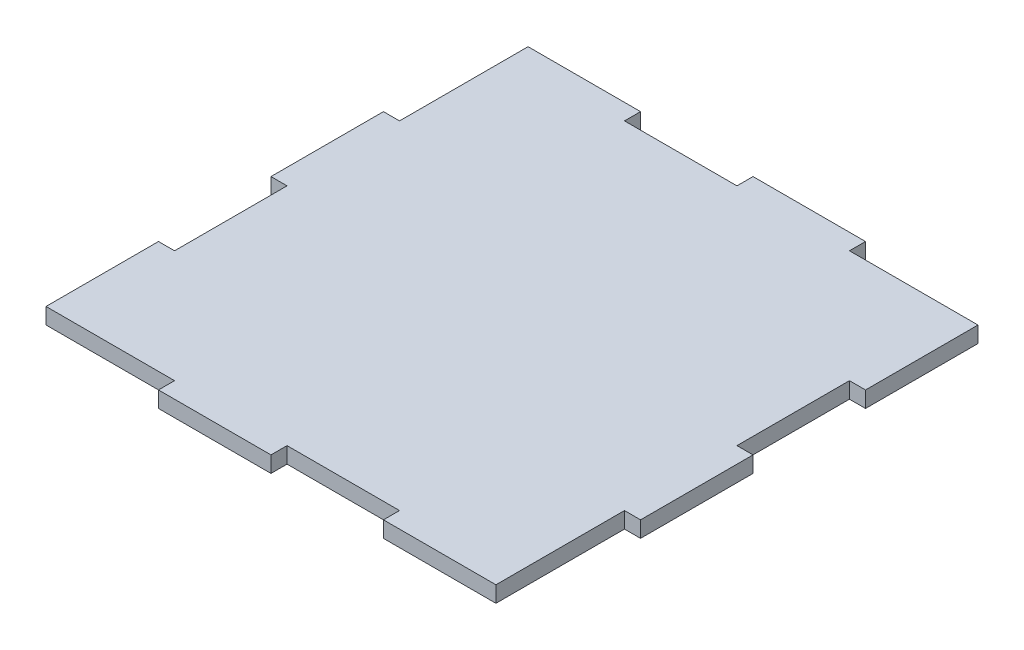
ISO-10303-21;
HEADER;
FILE_DESCRIPTION(('STEP AP214'),'2;1');
FILE_NAME('part.step','',(''),(''),'','','');
FILE_SCHEMA(('AUTOMOTIVE_DESIGN { 1 0 10303 214 1 1 1 1 }'));
ENDSEC;
DATA;
#1=APPLICATION_CONTEXT('core data for automotive mechanical design processes');
#2=APPLICATION_PROTOCOL_DEFINITION('international standard','automotive_design',2000,#1);
#3=PRODUCT_CONTEXT('',#1,'mechanical');
#4=PRODUCT('Part','Part','',(#3));
#5=PRODUCT_RELATED_PRODUCT_CATEGORY('part','',(#4));
#6=PRODUCT_DEFINITION_FORMATION('','',#4);
#7=PRODUCT_DEFINITION_CONTEXT('part definition',#1,'design');
#8=PRODUCT_DEFINITION('design','',#6,#7);
#9=PRODUCT_DEFINITION_SHAPE('','',#8);
#10=(LENGTH_UNIT() NAMED_UNIT(*) SI_UNIT(.MILLI.,.METRE.));
#11=(NAMED_UNIT(*) PLANE_ANGLE_UNIT() SI_UNIT($,.RADIAN.));
#12=(NAMED_UNIT(*) SI_UNIT($,.STERADIAN.) SOLID_ANGLE_UNIT());
#13=UNCERTAINTY_MEASURE_WITH_UNIT(LENGTH_MEASURE(1.E-05),#10,'distance_accuracy_value','');
#14=(GEOMETRIC_REPRESENTATION_CONTEXT(3) GLOBAL_UNCERTAINTY_ASSIGNED_CONTEXT((#13)) GLOBAL_UNIT_ASSIGNED_CONTEXT((#10,
#11,#12)) REPRESENTATION_CONTEXT('',''));
#15=CARTESIAN_POINT('',(0.,0.,0.));
#16=DIRECTION('',(0.,0.,1.));
#17=DIRECTION('',(1.,0.,0.));
#18=AXIS2_PLACEMENT_3D('',#15,#16,#17);
#19=CARTESIAN_POINT('',(0.,6.35,40.0372881355932));
#20=DIRECTION('',(0.,0.,-1.));
#21=DIRECTION('',(-1.,0.,0.));
#22=AXIS2_PLACEMENT_3D('',#19,#20,#21);
#23=PLANE('',#22);
#24=DIRECTION('',(1.,0.,0.));
#25=VECTOR('',#24,1.);
#26=CARTESIAN_POINT('',(0.,0.,40.0372881355932));
#27=LINE('',#26,#25);
#28=CARTESIAN_POINT('',(-118.856214689266,0.,40.0372881355932));
#29=VERTEX_POINT('',#28);
#30=CARTESIAN_POINT('',(-112.506214689266,0.,40.0372881355932));
#31=VERTEX_POINT('',#30);
#32=EDGE_CURVE('E248',#29,#31,#27,.T.);
#33=ORIENTED_EDGE('',*,*,#32,.F.);
#34=DIRECTION('',(0.,-1.,0.));
#35=VECTOR('',#34,1.);
#36=CARTESIAN_POINT('',(-118.856214689266,6.35,40.0372881355932));
#37=LINE('',#36,#35);
#38=CARTESIAN_POINT('',(-118.856214689266,6.35,40.0372881355932));
#39=VERTEX_POINT('',#38);
#40=EDGE_CURVE('E11',#39,#29,#37,.T.);
#41=ORIENTED_EDGE('',*,*,#40,.F.);
#42=DIRECTION('',(1.,0.,0.));
#43=VECTOR('',#42,1.);
#44=CARTESIAN_POINT('',(0.,6.35,40.0372881355932));
#45=LINE('',#44,#43);
#46=CARTESIAN_POINT('',(-112.506214689266,6.35,40.0372881355932));
#47=VERTEX_POINT('',#46);
#48=EDGE_CURVE('E397',#39,#47,#45,.T.);
#49=ORIENTED_EDGE('',*,*,#48,.T.);
#50=DIRECTION('',(0.,-1.,0.));
#51=VECTOR('',#50,1.);
#52=CARTESIAN_POINT('',(-112.506214689266,6.35,40.0372881355932));
#53=LINE('',#52,#51);
#54=EDGE_CURVE('E145',#47,#31,#53,.T.);
#55=ORIENTED_EDGE('',*,*,#54,.T.);
#56=EDGE_LOOP('',(#33,#41,#49,#55));
#57=FACE_BOUND('',#56,.T.);
#58=ADVANCED_FACE('F35',(#57),#23,.T.);
#59=CARTESIAN_POINT('',(-118.856214689266,6.35,0.));
#60=DIRECTION('',(-1.,0.,0.));
#61=DIRECTION('',(0.,0.,1.));
#62=AXIS2_PLACEMENT_3D('',#59,#60,#61);
#63=PLANE('',#62);
#64=DIRECTION('',(0.,0.,-1.));
#65=VECTOR('',#64,1.);
#66=CARTESIAN_POINT('',(-118.856214689266,0.,0.));
#67=LINE('',#66,#65);
#68=CARTESIAN_POINT('',(-118.856214689266,0.,84.4872881355932));
#69=VERTEX_POINT('',#68);
#70=EDGE_CURVE('E251',#69,#29,#67,.T.);
#71=ORIENTED_EDGE('',*,*,#70,.F.);
#72=DIRECTION('',(0.,-1.,0.));
#73=VECTOR('',#72,1.);
#74=CARTESIAN_POINT('',(-118.856214689266,6.35,84.4872881355932));
#75=LINE('',#74,#73);
#76=CARTESIAN_POINT('',(-118.856214689266,6.35,84.4872881355932));
#77=VERTEX_POINT('',#76);
#78=EDGE_CURVE('E43',#77,#69,#75,.T.);
#79=ORIENTED_EDGE('',*,*,#78,.F.);
#80=DIRECTION('',(0.,0.,-1.));
#81=VECTOR('',#80,1.);
#82=CARTESIAN_POINT('',(-118.856214689266,6.35,0.));
#83=LINE('',#82,#81);
#84=EDGE_CURVE('E393',#77,#39,#83,.T.);
#85=ORIENTED_EDGE('',*,*,#84,.T.);
#86=ORIENTED_EDGE('',*,*,#40,.T.);
#87=EDGE_LOOP('',(#71,#79,#85,#86));
#88=FACE_BOUND('',#87,.T.);
#89=ADVANCED_FACE('F381',(#88),#63,.T.);
#90=CARTESIAN_POINT('',(0.,6.35,84.4872881355932));
#91=DIRECTION('',(0.,0.,1.));
#92=DIRECTION('',(1.,0.,0.));
#93=AXIS2_PLACEMENT_3D('',#90,#91,#92);
#94=PLANE('',#93);
#95=DIRECTION('',(-1.,0.,0.));
#96=VECTOR('',#95,1.);
#97=CARTESIAN_POINT('',(0.,0.,84.4872881355932));
#98=LINE('',#97,#96);
#99=CARTESIAN_POINT('',(-68.0562146892665,0.,84.4872881355932));
#100=VERTEX_POINT('',#99);
#101=EDGE_CURVE('E254',#100,#69,#98,.T.);
#102=ORIENTED_EDGE('',*,*,#101,.F.);
#103=DIRECTION('',(0.,-1.,0.));
#104=VECTOR('',#103,1.);
#105=CARTESIAN_POINT('',(-68.0562146892665,6.35,84.4872881355932));
#106=LINE('',#105,#104);
#107=CARTESIAN_POINT('',(-68.0562146892665,6.35,84.4872881355932));
#108=VERTEX_POINT('',#107);
#109=EDGE_CURVE('E370',#108,#100,#106,.T.);
#110=ORIENTED_EDGE('',*,*,#109,.F.);
#111=DIRECTION('',(-1.,0.,0.));
#112=VECTOR('',#111,1.);
#113=CARTESIAN_POINT('',(0.,6.35,84.4872881355932));
#114=LINE('',#113,#112);
#115=EDGE_CURVE('E377',#108,#77,#114,.T.);
#116=ORIENTED_EDGE('',*,*,#115,.T.);
#117=ORIENTED_EDGE('',*,*,#78,.T.);
#118=EDGE_LOOP('',(#102,#110,#116,#117));
#119=FACE_BOUND('',#118,.T.);
#120=ADVANCED_FACE('F375',(#119),#94,.T.);
#121=CARTESIAN_POINT('',(-68.0562146892655,6.35,-7.43676934221016E-13));
#122=DIRECTION('',(-1.,0.,0.));
#123=DIRECTION('',(0.,0.,1.));
#124=AXIS2_PLACEMENT_3D('',#121,#122,#123);
#125=PLANE('',#124);
#126=DIRECTION('',(0.,0.,-1.));
#127=VECTOR('',#126,1.);
#128=CARTESIAN_POINT('',(-68.0562146892655,0.,-7.43676934221016E-13));
#129=LINE('',#128,#127);
#130=CARTESIAN_POINT('',(-68.0562146892665,0.,90.8372881355928));
#131=VERTEX_POINT('',#130);
#132=EDGE_CURVE('E257',#131,#100,#129,.T.);
#133=ORIENTED_EDGE('',*,*,#132,.F.);
#134=DIRECTION('',(0.,-1.,0.));
#135=VECTOR('',#134,1.);
#136=CARTESIAN_POINT('',(-68.0562146892665,6.35,90.8372881355928));
#137=LINE('',#136,#135);
#138=CARTESIAN_POINT('',(-68.0562146892665,6.35,90.8372881355928));
#139=VERTEX_POINT('',#138);
#140=EDGE_CURVE('E368',#139,#131,#137,.T.);
#141=ORIENTED_EDGE('',*,*,#140,.F.);
#142=DIRECTION('',(0.,0.,-1.));
#143=VECTOR('',#142,1.);
#144=CARTESIAN_POINT('',(-68.0562146892655,6.35,-7.43676934221016E-13));
#145=LINE('',#144,#143);
#146=EDGE_CURVE('E390',#139,#108,#145,.T.);
#147=ORIENTED_EDGE('',*,*,#146,.T.);
#148=ORIENTED_EDGE('',*,*,#109,.T.);
#149=EDGE_LOOP('',(#133,#141,#147,#148));
#150=FACE_BOUND('',#149,.T.);
#151=ADVANCED_FACE('F387',(#150),#125,.T.);
#152=CARTESIAN_POINT('',(-9.64254234704709E-13,6.35,90.8372881355935));
#153=DIRECTION('',(0.,0.,1.));
#154=DIRECTION('',(1.,0.,0.));
#155=AXIS2_PLACEMENT_3D('',#152,#153,#154);
#156=PLANE('',#155);
#157=DIRECTION('',(-1.,0.,0.));
#158=VECTOR('',#157,1.);
#159=CARTESIAN_POINT('',(-9.64254234704709E-13,0.,90.8372881355935));
#160=LINE('',#159,#158);
#161=CARTESIAN_POINT('',(-23.6062146892665,0.,90.8372881355932));
#162=VERTEX_POINT('',#161);
#163=EDGE_CURVE('E260',#162,#131,#160,.T.);
#164=ORIENTED_EDGE('',*,*,#163,.F.);
#165=DIRECTION('',(0.,-1.,0.));
#166=VECTOR('',#165,1.);
#167=CARTESIAN_POINT('',(-23.6062146892665,6.35,90.8372881355932));
#168=LINE('',#167,#166);
#169=CARTESIAN_POINT('',(-23.6062146892665,6.35,90.8372881355932));
#170=VERTEX_POINT('',#169);
#171=EDGE_CURVE('E366',#170,#162,#168,.T.);
#172=ORIENTED_EDGE('',*,*,#171,.F.);
#173=DIRECTION('',(-1.,0.,0.));
#174=VECTOR('',#173,1.);
#175=CARTESIAN_POINT('',(-9.64254234704709E-13,6.35,90.8372881355935));
#176=LINE('',#175,#174);
#177=EDGE_CURVE('E395',#170,#139,#176,.T.);
#178=ORIENTED_EDGE('',*,*,#177,.T.);
#179=ORIENTED_EDGE('',*,*,#140,.T.);
#180=EDGE_LOOP('',(#164,#172,#178,#179));
#181=FACE_BOUND('',#180,.T.);
#182=ADVANCED_FACE('F468',(#181),#156,.T.);
#183=CARTESIAN_POINT('',(-23.6062146892656,6.35,-2.32158924852762E-13));
#184=DIRECTION('',(1.,0.,0.));
#185=DIRECTION('',(0.,0.,-1.));
#186=AXIS2_PLACEMENT_3D('',#183,#184,#185);
#187=PLANE('',#186);
#188=DIRECTION('',(0.,0.,1.));
#189=VECTOR('',#188,1.);
#190=CARTESIAN_POINT('',(-23.6062146892656,0.,-2.32158924852762E-13));
#191=LINE('',#190,#189);
#192=CARTESIAN_POINT('',(-23.6062146892665,0.,84.4872881355932));
#193=VERTEX_POINT('',#192);
#194=EDGE_CURVE('E263',#193,#162,#191,.T.);
#195=ORIENTED_EDGE('',*,*,#194,.F.);
#196=DIRECTION('',(0.,-1.,0.));
#197=VECTOR('',#196,1.);
#198=CARTESIAN_POINT('',(-23.6062146892665,6.35,84.4872881355932));
#199=LINE('',#198,#197);
#200=CARTESIAN_POINT('',(-23.6062146892665,6.35,84.4872881355932));
#201=VERTEX_POINT('',#200);
#202=EDGE_CURVE('E364',#201,#193,#199,.T.);
#203=ORIENTED_EDGE('',*,*,#202,.F.);
#204=DIRECTION('',(0.,0.,1.));
#205=VECTOR('',#204,1.);
#206=CARTESIAN_POINT('',(-23.6062146892656,6.35,-2.32158924852762E-13));
#207=LINE('',#206,#205);
#208=EDGE_CURVE('E402',#201,#170,#207,.T.);
#209=ORIENTED_EDGE('',*,*,#208,.T.);
#210=ORIENTED_EDGE('',*,*,#171,.T.);
#211=EDGE_LOOP('',(#195,#203,#209,#210));
#212=FACE_BOUND('',#211,.T.);
#213=ADVANCED_FACE('F471',(#212),#187,.T.);
#214=CARTESIAN_POINT('',(0.,6.35,84.4872881355932));
#215=DIRECTION('',(0.,0.,-1.));
#216=DIRECTION('',(-1.,0.,0.));
#217=AXIS2_PLACEMENT_3D('',#214,#215,#216);
#218=PLANE('',#217);
#219=DIRECTION('',(1.,0.,0.));
#220=VECTOR('',#219,1.);
#221=CARTESIAN_POINT('',(0.,0.,84.4872881355932));
#222=LINE('',#221,#220);
#223=CARTESIAN_POINT('',(20.8437853107335,0.,84.4872881355932));
#224=VERTEX_POINT('',#223);
#225=EDGE_CURVE('E266',#193,#224,#222,.T.);
#226=ORIENTED_EDGE('',*,*,#225,.T.);
#227=DIRECTION('',(0.,-1.,0.));
#228=VECTOR('',#227,1.);
#229=CARTESIAN_POINT('',(20.8437853107335,6.35,84.4872881355932));
#230=LINE('',#229,#228);
#231=CARTESIAN_POINT('',(20.8437853107335,6.35,84.4872881355932));
#232=VERTEX_POINT('',#231);
#233=EDGE_CURVE('E362',#232,#224,#230,.T.);
#234=ORIENTED_EDGE('',*,*,#233,.F.);
#235=DIRECTION('',(1.,0.,0.));
#236=VECTOR('',#235,1.);
#237=CARTESIAN_POINT('',(0.,6.35,84.4872881355932));
#238=LINE('',#237,#236);
#239=EDGE_CURVE('E405',#201,#232,#238,.T.);
#240=ORIENTED_EDGE('',*,*,#239,.F.);
#241=ORIENTED_EDGE('',*,*,#202,.T.);
#242=EDGE_LOOP('',(#226,#234,#240,#241));
#243=FACE_BOUND('',#242,.T.);
#244=ADVANCED_FACE('F475',(#243),#218,.F.);
#245=CARTESIAN_POINT('',(20.8437853107344,6.35,2.04991391093394E-13));
#246=DIRECTION('',(-1.,0.,0.));
#247=DIRECTION('',(0.,0.,1.));
#248=AXIS2_PLACEMENT_3D('',#245,#246,#247);
#249=PLANE('',#248);
#250=DIRECTION('',(0.,0.,-1.));
#251=VECTOR('',#250,1.);
#252=CARTESIAN_POINT('',(20.8437853107344,0.,2.04991391093394E-13));
#253=LINE('',#252,#251);
#254=CARTESIAN_POINT('',(20.8437853107335,0.,90.8372881355937));
#255=VERTEX_POINT('',#254);
#256=EDGE_CURVE('E269',#255,#224,#253,.T.);
#257=ORIENTED_EDGE('',*,*,#256,.F.);
#258=DIRECTION('',(0.,-1.,0.));
#259=VECTOR('',#258,1.);
#260=CARTESIAN_POINT('',(20.8437853107335,6.35,90.8372881355937));
#261=LINE('',#260,#259);
#262=CARTESIAN_POINT('',(20.8437853107335,6.35,90.8372881355937));
#263=VERTEX_POINT('',#262);
#264=EDGE_CURVE('E360',#263,#255,#261,.T.);
#265=ORIENTED_EDGE('',*,*,#264,.F.);
#266=DIRECTION('',(0.,0.,-1.));
#267=VECTOR('',#266,1.);
#268=CARTESIAN_POINT('',(20.8437853107344,6.35,2.04991391093394E-13));
#269=LINE('',#268,#267);
#270=EDGE_CURVE('E407',#263,#232,#269,.T.);
#271=ORIENTED_EDGE('',*,*,#270,.T.);
#272=ORIENTED_EDGE('',*,*,#233,.T.);
#273=EDGE_LOOP('',(#257,#265,#271,#272));
#274=FACE_BOUND('',#273,.T.);
#275=ADVANCED_FACE('F479',(#274),#249,.T.);
#276=CARTESIAN_POINT('',(-9.64254234704709E-13,6.35,90.8372881355935));
#277=DIRECTION('',(0.,0.,1.));
#278=DIRECTION('',(1.,0.,0.));
#279=AXIS2_PLACEMENT_3D('',#276,#277,#278);
#280=PLANE('',#279);
#281=DIRECTION('',(-1.,0.,0.));
#282=VECTOR('',#281,1.);
#283=CARTESIAN_POINT('',(-9.64254234704709E-13,0.,90.8372881355935));
#284=LINE('',#283,#282);
#285=CARTESIAN_POINT('',(65.2937853107335,0.,90.8372881355942));
#286=VERTEX_POINT('',#285);
#287=EDGE_CURVE('E272',#286,#255,#284,.T.);
#288=ORIENTED_EDGE('',*,*,#287,.F.);
#289=DIRECTION('',(0.,-1.,0.));
#290=VECTOR('',#289,1.);
#291=CARTESIAN_POINT('',(65.2937853107335,6.35,90.8372881355942));
#292=LINE('',#291,#290);
#293=CARTESIAN_POINT('',(65.2937853107335,6.35,90.8372881355942));
#294=VERTEX_POINT('',#293);
#295=EDGE_CURVE('E358',#294,#286,#292,.T.);
#296=ORIENTED_EDGE('',*,*,#295,.F.);
#297=DIRECTION('',(-1.,0.,0.));
#298=VECTOR('',#297,1.);
#299=CARTESIAN_POINT('',(-9.64254234704709E-13,6.35,90.8372881355935));
#300=LINE('',#299,#298);
#301=EDGE_CURVE('E410',#294,#263,#300,.T.);
#302=ORIENTED_EDGE('',*,*,#301,.T.);
#303=ORIENTED_EDGE('',*,*,#264,.T.);
#304=EDGE_LOOP('',(#288,#296,#302,#303));
#305=FACE_BOUND('',#304,.T.);
#306=ADVANCED_FACE('F483',(#305),#280,.T.);
#307=CARTESIAN_POINT('',(65.2937853107345,6.35,7.13490785599501E-13));
#308=DIRECTION('',(1.,0.,0.));
#309=DIRECTION('',(0.,0.,-1.));
#310=AXIS2_PLACEMENT_3D('',#307,#308,#309);
#311=PLANE('',#310);
#312=DIRECTION('',(0.,0.,1.));
#313=VECTOR('',#312,1.);
#314=CARTESIAN_POINT('',(65.2937853107345,0.,7.13490785599501E-13));
#315=LINE('',#314,#313);
#316=CARTESIAN_POINT('',(65.2937853107345,0.,40.0372881355939));
#317=VERTEX_POINT('',#316);
#318=EDGE_CURVE('E275',#317,#286,#315,.T.);
#319=ORIENTED_EDGE('',*,*,#318,.F.);
#320=DIRECTION('',(0.,-1.,0.));
#321=VECTOR('',#320,1.);
#322=CARTESIAN_POINT('',(65.2937853107345,6.35,40.0372881355939));
#323=LINE('',#322,#321);
#324=CARTESIAN_POINT('',(65.2937853107345,6.35,40.0372881355939));
#325=VERTEX_POINT('',#324);
#326=EDGE_CURVE('E356',#325,#317,#323,.T.);
#327=ORIENTED_EDGE('',*,*,#326,.F.);
#328=DIRECTION('',(0.,0.,1.));
#329=VECTOR('',#328,1.);
#330=CARTESIAN_POINT('',(65.2937853107345,6.35,7.13490785599501E-13));
#331=LINE('',#330,#329);
#332=EDGE_CURVE('E413',#325,#294,#331,.T.);
#333=ORIENTED_EDGE('',*,*,#332,.T.);
#334=ORIENTED_EDGE('',*,*,#295,.T.);
#335=EDGE_LOOP('',(#319,#327,#333,#334));
#336=FACE_BOUND('',#335,.T.);
#337=ADVANCED_FACE('F487',(#336),#311,.T.);
#338=CARTESIAN_POINT('',(-3.0625219874194E-13,6.35,40.0372881355933));
#339=DIRECTION('',(0.,0.,1.));
#340=DIRECTION('',(1.,0.,0.));
#341=AXIS2_PLACEMENT_3D('',#338,#339,#340);
#342=PLANE('',#341);
#343=DIRECTION('',(-1.,0.,0.));
#344=VECTOR('',#343,1.);
#345=CARTESIAN_POINT('',(-3.0625219874194E-13,0.,40.0372881355933));
#346=LINE('',#345,#344);
#347=CARTESIAN_POINT('',(71.6437853107342,0.,40.0372881355939));
#348=VERTEX_POINT('',#347);
#349=EDGE_CURVE('E278',#348,#317,#346,.T.);
#350=ORIENTED_EDGE('',*,*,#349,.F.);
#351=DIRECTION('',(0.,-1.,0.));
#352=VECTOR('',#351,1.);
#353=CARTESIAN_POINT('',(71.6437853107342,6.35,40.0372881355939));
#354=LINE('',#353,#352);
#355=CARTESIAN_POINT('',(71.6437853107342,6.35,40.0372881355939));
#356=VERTEX_POINT('',#355);
#357=EDGE_CURVE('E354',#356,#348,#354,.T.);
#358=ORIENTED_EDGE('',*,*,#357,.F.);
#359=DIRECTION('',(-1.,0.,0.));
#360=VECTOR('',#359,1.);
#361=CARTESIAN_POINT('',(-3.0625219874194E-13,6.35,40.0372881355933));
#362=LINE('',#361,#360);
#363=EDGE_CURVE('E416',#356,#325,#362,.T.);
#364=ORIENTED_EDGE('',*,*,#363,.T.);
#365=ORIENTED_EDGE('',*,*,#326,.T.);
#366=EDGE_LOOP('',(#350,#358,#364,#365));
#367=FACE_BOUND('',#366,.T.);
#368=ADVANCED_FACE('F491',(#367),#342,.T.);
#369=CARTESIAN_POINT('',(71.6437853107345,6.35,5.14463819048205E-13));
#370=DIRECTION('',(1.,0.,0.));
#371=DIRECTION('',(0.,0.,-1.));
#372=AXIS2_PLACEMENT_3D('',#369,#370,#371);
#373=PLANE('',#372);
#374=DIRECTION('',(0.,0.,1.));
#375=VECTOR('',#374,1.);
#376=CARTESIAN_POINT('',(71.6437853107345,0.,5.14463819048205E-13));
#377=LINE('',#376,#375);
#378=CARTESIAN_POINT('',(71.6437853107345,0.,-4.4127118644061));
#379=VERTEX_POINT('',#378);
#380=EDGE_CURVE('E281',#379,#348,#377,.T.);
#381=ORIENTED_EDGE('',*,*,#380,.F.);
#382=DIRECTION('',(0.,-1.,0.));
#383=VECTOR('',#382,1.);
#384=CARTESIAN_POINT('',(71.6437853107345,6.35,-4.4127118644061));
#385=LINE('',#384,#383);
#386=CARTESIAN_POINT('',(71.6437853107345,6.35,-4.4127118644061));
#387=VERTEX_POINT('',#386);
#388=EDGE_CURVE('E352',#387,#379,#385,.T.);
#389=ORIENTED_EDGE('',*,*,#388,.F.);
#390=DIRECTION('',(0.,0.,1.));
#391=VECTOR('',#390,1.);
#392=CARTESIAN_POINT('',(71.6437853107345,6.35,5.14463819048205E-13));
#393=LINE('',#392,#391);
#394=EDGE_CURVE('E419',#387,#356,#393,.T.);
#395=ORIENTED_EDGE('',*,*,#394,.T.);
#396=ORIENTED_EDGE('',*,*,#357,.T.);
#397=EDGE_LOOP('',(#381,#389,#395,#396));
#398=FACE_BOUND('',#397,.T.);
#399=ADVANCED_FACE('F495',(#398),#373,.T.);
#400=CARTESIAN_POINT('',(0.,6.35,-4.41271186440659));
#401=DIRECTION('',(0.,0.,-1.));
#402=DIRECTION('',(-1.,0.,0.));
#403=AXIS2_PLACEMENT_3D('',#400,#401,#402);
#404=PLANE('',#403);
#405=DIRECTION('',(1.,0.,0.));
#406=VECTOR('',#405,1.);
#407=CARTESIAN_POINT('',(0.,0.,-4.41271186440659));
#408=LINE('',#407,#406);
#409=CARTESIAN_POINT('',(65.2937853107345,0.,-4.41271186440613));
#410=VERTEX_POINT('',#409);
#411=EDGE_CURVE('E284',#410,#379,#408,.T.);
#412=ORIENTED_EDGE('',*,*,#411,.F.);
#413=DIRECTION('',(0.,-1.,0.));
#414=VECTOR('',#413,1.);
#415=CARTESIAN_POINT('',(65.2937853107345,6.35,-4.41271186440613));
#416=LINE('',#415,#414);
#417=CARTESIAN_POINT('',(65.2937853107345,6.35,-4.41271186440613));
#418=VERTEX_POINT('',#417);
#419=EDGE_CURVE('E350',#418,#410,#416,.T.);
#420=ORIENTED_EDGE('',*,*,#419,.F.);
#421=DIRECTION('',(1.,0.,0.));
#422=VECTOR('',#421,1.);
#423=CARTESIAN_POINT('',(0.,6.35,-4.41271186440659));
#424=LINE('',#423,#422);
#425=EDGE_CURVE('E422',#418,#387,#424,.T.);
#426=ORIENTED_EDGE('',*,*,#425,.T.);
#427=ORIENTED_EDGE('',*,*,#388,.T.);
#428=EDGE_LOOP('',(#412,#420,#426,#427));
#429=FACE_BOUND('',#428,.T.);
#430=ADVANCED_FACE('F499',(#429),#404,.T.);
#431=CARTESIAN_POINT('',(65.2937853107345,6.35,0.));
#432=DIRECTION('',(1.,0.,0.));
#433=DIRECTION('',(0.,0.,-1.));
#434=AXIS2_PLACEMENT_3D('',#431,#432,#433);
#435=PLANE('',#434);
#436=DIRECTION('',(0.,0.,1.));
#437=VECTOR('',#436,1.);
#438=CARTESIAN_POINT('',(65.2937853107345,0.,0.));
#439=LINE('',#438,#437);
#440=CARTESIAN_POINT('',(65.2937853107345,0.,-48.8627118644061));
#441=VERTEX_POINT('',#440);
#442=EDGE_CURVE('E287',#441,#410,#439,.T.);
#443=ORIENTED_EDGE('',*,*,#442,.F.);
#444=DIRECTION('',(0.,-1.,0.));
#445=VECTOR('',#444,1.);
#446=CARTESIAN_POINT('',(65.2937853107345,6.35,-48.8627118644061));
#447=LINE('',#446,#445);
#448=CARTESIAN_POINT('',(65.2937853107345,6.35,-48.8627118644061));
#449=VERTEX_POINT('',#448);
#450=EDGE_CURVE('E348',#449,#441,#447,.T.);
#451=ORIENTED_EDGE('',*,*,#450,.F.);
#452=DIRECTION('',(0.,0.,1.));
#453=VECTOR('',#452,1.);
#454=CARTESIAN_POINT('',(65.2937853107345,6.35,0.));
#455=LINE('',#454,#453);
#456=EDGE_CURVE('E425',#449,#418,#455,.T.);
#457=ORIENTED_EDGE('',*,*,#456,.T.);
#458=ORIENTED_EDGE('',*,*,#419,.T.);
#459=EDGE_LOOP('',(#443,#451,#457,#458));
#460=FACE_BOUND('',#459,.T.);
#461=ADVANCED_FACE('F503',(#460),#435,.T.);
#462=CARTESIAN_POINT('',(3.73759403840968E-13,6.35,-48.8627118644066));
#463=DIRECTION('',(0.,0.,1.));
#464=DIRECTION('',(1.,0.,0.));
#465=AXIS2_PLACEMENT_3D('',#462,#463,#464);
#466=PLANE('',#465);
#467=DIRECTION('',(-1.,0.,0.));
#468=VECTOR('',#467,1.);
#469=CARTESIAN_POINT('',(3.73759403840968E-13,0.,-48.8627118644066));
#470=LINE('',#469,#468);
#471=CARTESIAN_POINT('',(71.6437853107348,0.,-48.8627118644061));
#472=VERTEX_POINT('',#471);
#473=EDGE_CURVE('E290',#472,#441,#470,.T.);
#474=ORIENTED_EDGE('',*,*,#473,.F.);
#475=DIRECTION('',(0.,-1.,0.));
#476=VECTOR('',#475,1.);
#477=CARTESIAN_POINT('',(71.6437853107348,6.35,-48.8627118644061));
#478=LINE('',#477,#476);
#479=CARTESIAN_POINT('',(71.6437853107348,6.35,-48.8627118644061));
#480=VERTEX_POINT('',#479);
#481=EDGE_CURVE('E346',#480,#472,#478,.T.);
#482=ORIENTED_EDGE('',*,*,#481,.F.);
#483=DIRECTION('',(-1.,0.,0.));
#484=VECTOR('',#483,1.);
#485=CARTESIAN_POINT('',(3.73759403840968E-13,6.35,-48.8627118644066));
#486=LINE('',#485,#484);
#487=EDGE_CURVE('E428',#480,#449,#486,.T.);
#488=ORIENTED_EDGE('',*,*,#487,.T.);
#489=ORIENTED_EDGE('',*,*,#450,.T.);
#490=EDGE_LOOP('',(#474,#482,#488,#489));
#491=FACE_BOUND('',#490,.T.);
#492=ADVANCED_FACE('F507',(#491),#466,.T.);
#493=CARTESIAN_POINT('',(71.6437853107345,6.35,5.14463819048205E-13));
#494=DIRECTION('',(1.,0.,0.));
#495=DIRECTION('',(0.,0.,-1.));
#496=AXIS2_PLACEMENT_3D('',#493,#494,#495);
#497=PLANE('',#496);
#498=DIRECTION('',(0.,0.,1.));
#499=VECTOR('',#498,1.);
#500=CARTESIAN_POINT('',(71.6437853107345,0.,5.14463819048205E-13));
#501=LINE('',#500,#499);
#502=CARTESIAN_POINT('',(71.6437853107351,0.,-93.3127118644061));
#503=VERTEX_POINT('',#502);
#504=EDGE_CURVE('E293',#503,#472,#501,.T.);
#505=ORIENTED_EDGE('',*,*,#504,.F.);
#506=DIRECTION('',(0.,-1.,0.));
#507=VECTOR('',#506,1.);
#508=CARTESIAN_POINT('',(71.6437853107351,6.35,-93.3127118644061));
#509=LINE('',#508,#507);
#510=CARTESIAN_POINT('',(71.6437853107351,6.35,-93.3127118644061));
#511=VERTEX_POINT('',#510);
#512=EDGE_CURVE('E344',#511,#503,#509,.T.);
#513=ORIENTED_EDGE('',*,*,#512,.F.);
#514=DIRECTION('',(0.,0.,1.));
#515=VECTOR('',#514,1.);
#516=CARTESIAN_POINT('',(71.6437853107345,6.35,5.14463819048205E-13));
#517=LINE('',#516,#515);
#518=EDGE_CURVE('E431',#511,#480,#517,.T.);
#519=ORIENTED_EDGE('',*,*,#518,.T.);
#520=ORIENTED_EDGE('',*,*,#481,.T.);
#521=EDGE_LOOP('',(#505,#513,#519,#520));
#522=FACE_BOUND('',#521,.T.);
#523=ADVANCED_FACE('F511',(#522),#497,.T.);
#524=CARTESIAN_POINT('',(0.,6.35,-93.3127118644068));
#525=DIRECTION('',(0.,0.,-1.));
#526=DIRECTION('',(-1.,0.,0.));
#527=AXIS2_PLACEMENT_3D('',#524,#525,#526);
#528=PLANE('',#527);
#529=DIRECTION('',(1.,0.,0.));
#530=VECTOR('',#529,1.);
#531=CARTESIAN_POINT('',(0.,0.,-93.3127118644068));
#532=LINE('',#531,#530);
#533=CARTESIAN_POINT('',(20.8437853107348,0.,-93.3127118644068));
#534=VERTEX_POINT('',#533);
#535=EDGE_CURVE('E296',#534,#503,#532,.T.);
#536=ORIENTED_EDGE('',*,*,#535,.F.);
#537=DIRECTION('',(0.,-1.,0.));
#538=VECTOR('',#537,1.);
#539=CARTESIAN_POINT('',(20.8437853107348,6.35,-93.3127118644068));
#540=LINE('',#539,#538);
#541=CARTESIAN_POINT('',(20.8437853107348,6.35,-93.3127118644068));
#542=VERTEX_POINT('',#541);
#543=EDGE_CURVE('E342',#542,#534,#540,.T.);
#544=ORIENTED_EDGE('',*,*,#543,.F.);
#545=DIRECTION('',(1.,0.,0.));
#546=VECTOR('',#545,1.);
#547=CARTESIAN_POINT('',(0.,6.35,-93.3127118644068));
#548=LINE('',#547,#546);
#549=EDGE_CURVE('E434',#542,#511,#548,.T.);
#550=ORIENTED_EDGE('',*,*,#549,.T.);
#551=ORIENTED_EDGE('',*,*,#512,.T.);
#552=EDGE_LOOP('',(#536,#544,#550,#551));
#553=FACE_BOUND('',#552,.T.);
#554=ADVANCED_FACE('F515',(#553),#528,.T.);
#555=CARTESIAN_POINT('',(20.8437853107345,6.35,0.));
#556=DIRECTION('',(1.,0.,0.));
#557=DIRECTION('',(0.,0.,-1.));
#558=AXIS2_PLACEMENT_3D('',#555,#556,#557);
#559=PLANE('',#558);
#560=DIRECTION('',(0.,0.,1.));
#561=VECTOR('',#560,1.);
#562=CARTESIAN_POINT('',(20.8437853107345,0.,0.));
#563=LINE('',#562,#561);
#564=CARTESIAN_POINT('',(20.8437853107348,0.,-99.6627118644066));
#565=VERTEX_POINT('',#564);
#566=EDGE_CURVE('E299',#565,#534,#563,.T.);
#567=ORIENTED_EDGE('',*,*,#566,.F.);
#568=DIRECTION('',(0.,-1.,0.));
#569=VECTOR('',#568,1.);
#570=CARTESIAN_POINT('',(20.8437853107348,6.35,-99.6627118644066));
#571=LINE('',#570,#569);
#572=CARTESIAN_POINT('',(20.8437853107348,6.35,-99.6627118644066));
#573=VERTEX_POINT('',#572);
#574=EDGE_CURVE('E340',#573,#565,#571,.T.);
#575=ORIENTED_EDGE('',*,*,#574,.F.);
#576=DIRECTION('',(0.,0.,1.));
#577=VECTOR('',#576,1.);
#578=CARTESIAN_POINT('',(20.8437853107345,6.35,0.));
#579=LINE('',#578,#577);
#580=EDGE_CURVE('E437',#573,#542,#579,.T.);
#581=ORIENTED_EDGE('',*,*,#580,.T.);
#582=ORIENTED_EDGE('',*,*,#543,.T.);
#583=EDGE_LOOP('',(#567,#575,#581,#582));
#584=FACE_BOUND('',#583,.T.);
#585=ADVANCED_FACE('F517',(#584),#559,.T.);
#586=CARTESIAN_POINT('',(3.42273962737041E-13,6.35,-99.6627118644067));
#587=DIRECTION('',(0.,0.,-1.));
#588=DIRECTION('',(-1.,0.,0.));
#589=AXIS2_PLACEMENT_3D('',#586,#587,#588);
#590=PLANE('',#589);
#591=DIRECTION('',(1.,0.,0.));
#592=VECTOR('',#591,1.);
#593=CARTESIAN_POINT('',(3.42273962737041E-13,0.,-99.6627118644067));
#594=LINE('',#593,#592);
#595=CARTESIAN_POINT('',(-23.6062146892652,0.,-99.6627118644068));
#596=VERTEX_POINT('',#595);
#597=EDGE_CURVE('E303',#596,#565,#594,.T.);
#598=ORIENTED_EDGE('',*,*,#597,.F.);
#599=DIRECTION('',(0.,-1.,0.));
#600=VECTOR('',#599,1.);
#601=CARTESIAN_POINT('',(-23.6062146892652,6.35,-99.6627118644068));
#602=LINE('',#601,#600);
#603=CARTESIAN_POINT('',(-23.6062146892652,6.35,-99.6627118644068));
#604=VERTEX_POINT('',#603);
#605=EDGE_CURVE('E338',#604,#596,#602,.T.);
#606=ORIENTED_EDGE('',*,*,#605,.F.);
#607=DIRECTION('',(1.,0.,0.));
#608=VECTOR('',#607,1.);
#609=CARTESIAN_POINT('',(3.42273962737041E-13,6.35,-99.6627118644067));
#610=LINE('',#609,#608);
#611=EDGE_CURVE('E441',#604,#573,#610,.T.);
#612=ORIENTED_EDGE('',*,*,#611,.T.);
#613=ORIENTED_EDGE('',*,*,#574,.T.);
#614=EDGE_LOOP('',(#598,#606,#612,#613));
#615=FACE_BOUND('',#614,.T.);
#616=ADVANCED_FACE('F520',(#615),#590,.T.);
#617=CARTESIAN_POINT('',(-23.6062146892655,6.35,0.));
#618=DIRECTION('',(-1.,0.,0.));
#619=DIRECTION('',(0.,0.,1.));
#620=AXIS2_PLACEMENT_3D('',#617,#618,#619);
#621=PLANE('',#620);
#622=DIRECTION('',(0.,0.,-1.));
#623=VECTOR('',#622,1.);
#624=CARTESIAN_POINT('',(-23.6062146892655,0.,0.));
#625=LINE('',#624,#623);
#626=CARTESIAN_POINT('',(-23.6062146892652,0.,-93.3127118644068));
#627=VERTEX_POINT('',#626);
#628=EDGE_CURVE('E306',#627,#596,#625,.T.);
#629=ORIENTED_EDGE('',*,*,#628,.F.);
#630=DIRECTION('',(0.,-1.,0.));
#631=VECTOR('',#630,1.);
#632=CARTESIAN_POINT('',(-23.6062146892652,6.35,-93.3127118644068));
#633=LINE('',#632,#631);
#634=CARTESIAN_POINT('',(-23.6062146892652,6.35,-93.3127118644068));
#635=VERTEX_POINT('',#634);
#636=EDGE_CURVE('E336',#635,#627,#633,.T.);
#637=ORIENTED_EDGE('',*,*,#636,.F.);
#638=DIRECTION('',(0.,0.,-1.));
#639=VECTOR('',#638,1.);
#640=CARTESIAN_POINT('',(-23.6062146892655,6.35,0.));
#641=LINE('',#640,#639);
#642=EDGE_CURVE('E444',#635,#604,#641,.T.);
#643=ORIENTED_EDGE('',*,*,#642,.T.);
#644=ORIENTED_EDGE('',*,*,#605,.T.);
#645=EDGE_LOOP('',(#629,#637,#643,#644));
#646=FACE_BOUND('',#645,.T.);
#647=ADVANCED_FACE('F524',(#646),#621,.T.);
#648=CARTESIAN_POINT('',(-68.0562146892652,0.,-93.3127118644068));
#649=VERTEX_POINT('',#648);
#650=EDGE_CURVE('E300',#649,#627,#532,.T.);
#651=ORIENTED_EDGE('',*,*,#650,.F.);
#652=DIRECTION('',(0.,-1.,0.));
#653=VECTOR('',#652,1.);
#654=CARTESIAN_POINT('',(-68.0562146892652,6.35,-93.3127118644068));
#655=LINE('',#654,#653);
#656=CARTESIAN_POINT('',(-68.0562146892652,6.35,-93.3127118644068));
#657=VERTEX_POINT('',#656);
#658=EDGE_CURVE('E334',#657,#649,#655,.T.);
#659=ORIENTED_EDGE('',*,*,#658,.F.);
#660=EDGE_CURVE('E438',#657,#635,#548,.T.);
#661=ORIENTED_EDGE('',*,*,#660,.T.);
#662=ORIENTED_EDGE('',*,*,#636,.T.);
#663=EDGE_LOOP('',(#651,#659,#661,#662));
#664=FACE_BOUND('',#663,.T.);
#665=ADVANCED_FACE('F528',(#664),#528,.T.);
#666=CARTESIAN_POINT('',(-68.0562146892654,6.35,-1.48735386844203E-13));
#667=DIRECTION('',(1.,0.,0.));
#668=DIRECTION('',(0.,0.,-1.));
#669=AXIS2_PLACEMENT_3D('',#666,#667,#668);
#670=PLANE('',#669);
#671=DIRECTION('',(0.,0.,1.));
#672=VECTOR('',#671,1.);
#673=CARTESIAN_POINT('',(-68.0562146892654,0.,-1.48735386844203E-13));
#674=LINE('',#673,#672);
#675=CARTESIAN_POINT('',(-68.0562146892652,0.,-99.6627118644069));
#676=VERTEX_POINT('',#675);
#677=EDGE_CURVE('E309',#676,#649,#674,.T.);
#678=ORIENTED_EDGE('',*,*,#677,.F.);
#679=DIRECTION('',(0.,-1.,0.));
#680=VECTOR('',#679,1.);
#681=CARTESIAN_POINT('',(-68.0562146892652,6.35,-99.6627118644069));
#682=LINE('',#681,#680);
#683=CARTESIAN_POINT('',(-68.0562146892652,6.35,-99.6627118644069));
#684=VERTEX_POINT('',#683);
#685=EDGE_CURVE('E332',#684,#676,#682,.T.);
#686=ORIENTED_EDGE('',*,*,#685,.F.);
#687=DIRECTION('',(0.,0.,1.));
#688=VECTOR('',#687,1.);
#689=CARTESIAN_POINT('',(-68.0562146892654,6.35,-1.48735386844203E-13));
#690=LINE('',#689,#688);
#691=EDGE_CURVE('E447',#684,#657,#690,.T.);
#692=ORIENTED_EDGE('',*,*,#691,.T.);
#693=ORIENTED_EDGE('',*,*,#658,.T.);
#694=EDGE_LOOP('',(#678,#686,#692,#693));
#695=FACE_BOUND('',#694,.T.);
#696=ADVANCED_FACE('F532',(#695),#670,.T.);
#697=CARTESIAN_POINT('',(3.42273962737041E-13,6.35,-99.6627118644067));
#698=DIRECTION('',(0.,0.,-1.));
#699=DIRECTION('',(-1.,0.,0.));
#700=AXIS2_PLACEMENT_3D('',#697,#698,#699);
#701=PLANE('',#700);
#702=DIRECTION('',(1.,0.,0.));
#703=VECTOR('',#702,1.);
#704=CARTESIAN_POINT('',(3.42273962737041E-13,0.,-99.6627118644067));
#705=LINE('',#704,#703);
#706=CARTESIAN_POINT('',(-112.506214689265,0.,-99.6627118644071));
#707=VERTEX_POINT('',#706);
#708=EDGE_CURVE('E312',#707,#676,#705,.T.);
#709=ORIENTED_EDGE('',*,*,#708,.F.);
#710=DIRECTION('',(0.,-1.,0.));
#711=VECTOR('',#710,1.);
#712=CARTESIAN_POINT('',(-112.506214689265,6.35,-99.6627118644071));
#713=LINE('',#712,#711);
#714=CARTESIAN_POINT('',(-112.506214689265,6.35,-99.6627118644071));
#715=VERTEX_POINT('',#714);
#716=EDGE_CURVE('E330',#715,#707,#713,.T.);
#717=ORIENTED_EDGE('',*,*,#716,.F.);
#718=DIRECTION('',(1.,0.,0.));
#719=VECTOR('',#718,1.);
#720=CARTESIAN_POINT('',(3.42273962737041E-13,6.35,-99.6627118644067));
#721=LINE('',#720,#719);
#722=EDGE_CURVE('E450',#715,#684,#721,.T.);
#723=ORIENTED_EDGE('',*,*,#722,.T.);
#724=ORIENTED_EDGE('',*,*,#685,.T.);
#725=EDGE_LOOP('',(#709,#717,#723,#724));
#726=FACE_BOUND('',#725,.T.);
#727=ADVANCED_FACE('F536',(#726),#701,.T.);
#728=CARTESIAN_POINT('',(-112.506214689266,6.35,0.));
#729=DIRECTION('',(1.,0.,0.));
#730=DIRECTION('',(0.,0.,-1.));
#731=AXIS2_PLACEMENT_3D('',#728,#729,#730);
#732=PLANE('',#731);
#733=DIRECTION('',(0.,0.,1.));
#734=VECTOR('',#733,1.);
#735=CARTESIAN_POINT('',(-112.506214689266,0.,0.));
#736=LINE('',#735,#734);
#737=CARTESIAN_POINT('',(-112.506214689266,0.,-48.8627118644068));
#738=VERTEX_POINT('',#737);
#739=EDGE_CURVE('E315',#707,#738,#736,.T.);
#740=ORIENTED_EDGE('',*,*,#739,.T.);
#741=DIRECTION('',(0.,-1.,0.));
#742=VECTOR('',#741,1.);
#743=CARTESIAN_POINT('',(-112.506214689266,6.35,-48.8627118644068));
#744=LINE('',#743,#742);
#745=CARTESIAN_POINT('',(-112.506214689266,6.35,-48.8627118644068));
#746=VERTEX_POINT('',#745);
#747=EDGE_CURVE('E328',#746,#738,#744,.T.);
#748=ORIENTED_EDGE('',*,*,#747,.F.);
#749=DIRECTION('',(0.,0.,1.));
#750=VECTOR('',#749,1.);
#751=CARTESIAN_POINT('',(-112.506214689266,6.35,0.));
#752=LINE('',#751,#750);
#753=EDGE_CURVE('E245',#715,#746,#752,.T.);
#754=ORIENTED_EDGE('',*,*,#753,.F.);
#755=ORIENTED_EDGE('',*,*,#716,.T.);
#756=EDGE_LOOP('',(#740,#748,#754,#755));
#757=FACE_BOUND('',#756,.T.);
#758=ADVANCED_FACE('F540',(#757),#732,.F.);
#759=CARTESIAN_POINT('',(0.,6.35,-48.8627118644068));
#760=DIRECTION('',(0.,0.,-1.));
#761=DIRECTION('',(-1.,0.,0.));
#762=AXIS2_PLACEMENT_3D('',#759,#760,#761);
#763=PLANE('',#762);
#764=DIRECTION('',(1.,0.,0.));
#765=VECTOR('',#764,1.);
#766=CARTESIAN_POINT('',(0.,0.,-48.8627118644068));
#767=LINE('',#766,#765);
#768=CARTESIAN_POINT('',(-118.856214689266,0.,-48.8627118644068));
#769=VERTEX_POINT('',#768);
#770=EDGE_CURVE('E318',#769,#738,#767,.T.);
#771=ORIENTED_EDGE('',*,*,#770,.F.);
#772=DIRECTION('',(0.,-1.,0.));
#773=VECTOR('',#772,1.);
#774=CARTESIAN_POINT('',(-118.856214689266,6.35,-48.8627118644068));
#775=LINE('',#774,#773);
#776=CARTESIAN_POINT('',(-118.856214689266,6.35,-48.8627118644068));
#777=VERTEX_POINT('',#776);
#778=EDGE_CURVE('E234',#777,#769,#775,.T.);
#779=ORIENTED_EDGE('',*,*,#778,.F.);
#780=DIRECTION('',(1.,0.,0.));
#781=VECTOR('',#780,1.);
#782=CARTESIAN_POINT('',(0.,6.35,-48.8627118644068));
#783=LINE('',#782,#781);
#784=EDGE_CURVE('E240',#777,#746,#783,.T.);
#785=ORIENTED_EDGE('',*,*,#784,.T.);
#786=ORIENTED_EDGE('',*,*,#747,.T.);
#787=EDGE_LOOP('',(#771,#779,#785,#786));
#788=FACE_BOUND('',#787,.T.);
#789=ADVANCED_FACE('F454',(#788),#763,.T.);
#790=CARTESIAN_POINT('',(-118.856214689266,6.35,0.));
#791=DIRECTION('',(-1.,0.,0.));
#792=DIRECTION('',(0.,0.,1.));
#793=AXIS2_PLACEMENT_3D('',#790,#791,#792);
#794=PLANE('',#793);
#795=DIRECTION('',(0.,0.,-1.));
#796=VECTOR('',#795,1.);
#797=CARTESIAN_POINT('',(-118.856214689266,0.,0.));
#798=LINE('',#797,#796);
#799=CARTESIAN_POINT('',(-118.856214689266,0.,-4.41271186440677));
#800=VERTEX_POINT('',#799);
#801=EDGE_CURVE('E229',#800,#769,#798,.T.);
#802=ORIENTED_EDGE('',*,*,#801,.F.);
#803=DIRECTION('',(0.,-1.,0.));
#804=VECTOR('',#803,1.);
#805=CARTESIAN_POINT('',(-118.856214689266,6.35,-4.41271186440677));
#806=LINE('',#805,#804);
#807=CARTESIAN_POINT('',(-118.856214689266,6.35,-4.41271186440677));
#808=VERTEX_POINT('',#807);
#809=EDGE_CURVE('E224',#808,#800,#806,.T.);
#810=ORIENTED_EDGE('',*,*,#809,.F.);
#811=DIRECTION('',(0.,0.,-1.));
#812=VECTOR('',#811,1.);
#813=CARTESIAN_POINT('',(-118.856214689266,6.35,0.));
#814=LINE('',#813,#812);
#815=EDGE_CURVE('E227',#808,#777,#814,.T.);
#816=ORIENTED_EDGE('',*,*,#815,.T.);
#817=ORIENTED_EDGE('',*,*,#778,.T.);
#818=EDGE_LOOP('',(#802,#810,#816,#817));
#819=FACE_BOUND('',#818,.T.);
#820=ADVANCED_FACE('F226',(#819),#794,.T.);
#821=CARTESIAN_POINT('',(0.,6.35,-4.41271186440678));
#822=DIRECTION('',(0.,0.,1.));
#823=DIRECTION('',(1.,0.,0.));
#824=AXIS2_PLACEMENT_3D('',#821,#822,#823);
#825=PLANE('',#824);
#826=DIRECTION('',(-1.,0.,0.));
#827=VECTOR('',#826,1.);
#828=CARTESIAN_POINT('',(0.,0.,-4.41271186440678));
#829=LINE('',#828,#827);
#830=CARTESIAN_POINT('',(-112.506214689266,0.,-4.41271186440677));
#831=VERTEX_POINT('',#830);
#832=EDGE_CURVE('E323',#831,#800,#829,.T.);
#833=ORIENTED_EDGE('',*,*,#832,.F.);
#834=DIRECTION('',(0.,-1.,0.));
#835=VECTOR('',#834,1.);
#836=CARTESIAN_POINT('',(-112.506214689266,6.35,-4.41271186440677));
#837=LINE('',#836,#835);
#838=CARTESIAN_POINT('',(-112.506214689266,6.35,-4.41271186440677));
#839=VERTEX_POINT('',#838);
#840=EDGE_CURVE('E138',#839,#831,#837,.T.);
#841=ORIENTED_EDGE('',*,*,#840,.F.);
#842=DIRECTION('',(-1.,0.,0.));
#843=VECTOR('',#842,1.);
#844=CARTESIAN_POINT('',(0.,6.35,-4.41271186440678));
#845=LINE('',#844,#843);
#846=EDGE_CURVE('E238',#839,#808,#845,.T.);
#847=ORIENTED_EDGE('',*,*,#846,.T.);
#848=ORIENTED_EDGE('',*,*,#809,.T.);
#849=EDGE_LOOP('',(#833,#841,#847,#848));
#850=FACE_BOUND('',#849,.T.);
#851=ADVANCED_FACE('F242',(#850),#825,.T.);
#852=EDGE_CURVE('E319',#831,#31,#736,.T.);
#853=ORIENTED_EDGE('',*,*,#852,.T.);
#854=ORIENTED_EDGE('',*,*,#54,.F.);
#855=EDGE_CURVE('E51',#839,#47,#752,.T.);
#856=ORIENTED_EDGE('',*,*,#855,.F.);
#857=ORIENTED_EDGE('',*,*,#840,.T.);
#858=EDGE_LOOP('',(#853,#854,#856,#857));
#859=FACE_BOUND('',#858,.T.);
#860=ADVANCED_FACE('F548',(#859),#732,.F.);
#861=CARTESIAN_POINT('',(0.,6.35,0.));
#862=DIRECTION('',(0.,1.,0.));
#863=DIRECTION('',(0.,0.,1.));
#864=AXIS2_PLACEMENT_3D('',#861,#862,#863);
#865=PLANE('',#864);
#866=ORIENTED_EDGE('',*,*,#48,.F.);
#867=ORIENTED_EDGE('',*,*,#84,.F.);
#868=ORIENTED_EDGE('',*,*,#115,.F.);
#869=ORIENTED_EDGE('',*,*,#146,.F.);
#870=ORIENTED_EDGE('',*,*,#177,.F.);
#871=ORIENTED_EDGE('',*,*,#208,.F.);
#872=ORIENTED_EDGE('',*,*,#239,.T.);
#873=ORIENTED_EDGE('',*,*,#270,.F.);
#874=ORIENTED_EDGE('',*,*,#301,.F.);
#875=ORIENTED_EDGE('',*,*,#332,.F.);
#876=ORIENTED_EDGE('',*,*,#363,.F.);
#877=ORIENTED_EDGE('',*,*,#394,.F.);
#878=ORIENTED_EDGE('',*,*,#425,.F.);
#879=ORIENTED_EDGE('',*,*,#456,.F.);
#880=ORIENTED_EDGE('',*,*,#487,.F.);
#881=ORIENTED_EDGE('',*,*,#518,.F.);
#882=ORIENTED_EDGE('',*,*,#549,.F.);
#883=ORIENTED_EDGE('',*,*,#580,.F.);
#884=ORIENTED_EDGE('',*,*,#611,.F.);
#885=ORIENTED_EDGE('',*,*,#642,.F.);
#886=ORIENTED_EDGE('',*,*,#660,.F.);
#887=ORIENTED_EDGE('',*,*,#691,.F.);
#888=ORIENTED_EDGE('',*,*,#722,.F.);
#889=ORIENTED_EDGE('',*,*,#753,.T.);
#890=ORIENTED_EDGE('',*,*,#784,.F.);
#891=ORIENTED_EDGE('',*,*,#815,.F.);
#892=ORIENTED_EDGE('',*,*,#846,.F.);
#893=ORIENTED_EDGE('',*,*,#855,.T.);
#894=EDGE_LOOP('',(#866,#867,#868,#869,#870,#871,#872,#873,#874,#875,#876,#877,#878,#879,#880,
#881,#882,#883,#884,#885,#886,#887,#888,#889,#890,#891,#892,#893));
#895=FACE_BOUND('',#894,.T.);
#896=ADVANCED_FACE('F237',(#895),#865,.T.);
#897=CARTESIAN_POINT('',(0.,0.,0.));
#898=DIRECTION('',(0.,1.,0.));
#899=DIRECTION('',(0.,0.,1.));
#900=AXIS2_PLACEMENT_3D('',#897,#898,#899);
#901=PLANE('',#900);
#902=ORIENTED_EDGE('',*,*,#32,.T.);
#903=ORIENTED_EDGE('',*,*,#852,.F.);
#904=ORIENTED_EDGE('',*,*,#832,.T.);
#905=ORIENTED_EDGE('',*,*,#801,.T.);
#906=ORIENTED_EDGE('',*,*,#770,.T.);
#907=ORIENTED_EDGE('',*,*,#739,.F.);
#908=ORIENTED_EDGE('',*,*,#708,.T.);
#909=ORIENTED_EDGE('',*,*,#677,.T.);
#910=ORIENTED_EDGE('',*,*,#650,.T.);
#911=ORIENTED_EDGE('',*,*,#628,.T.);
#912=ORIENTED_EDGE('',*,*,#597,.T.);
#913=ORIENTED_EDGE('',*,*,#566,.T.);
#914=ORIENTED_EDGE('',*,*,#535,.T.);
#915=ORIENTED_EDGE('',*,*,#504,.T.);
#916=ORIENTED_EDGE('',*,*,#473,.T.);
#917=ORIENTED_EDGE('',*,*,#442,.T.);
#918=ORIENTED_EDGE('',*,*,#411,.T.);
#919=ORIENTED_EDGE('',*,*,#380,.T.);
#920=ORIENTED_EDGE('',*,*,#349,.T.);
#921=ORIENTED_EDGE('',*,*,#318,.T.);
#922=ORIENTED_EDGE('',*,*,#287,.T.);
#923=ORIENTED_EDGE('',*,*,#256,.T.);
#924=ORIENTED_EDGE('',*,*,#225,.F.);
#925=ORIENTED_EDGE('',*,*,#194,.T.);
#926=ORIENTED_EDGE('',*,*,#163,.T.);
#927=ORIENTED_EDGE('',*,*,#132,.T.);
#928=ORIENTED_EDGE('',*,*,#101,.T.);
#929=ORIENTED_EDGE('',*,*,#70,.T.);
#930=EDGE_LOOP('',(#902,#903,#904,#905,#906,#907,#908,#909,#910,#911,#912,#913,#914,#915,#916,
#917,#918,#919,#920,#921,#922,#923,#924,#925,#926,#927,#928,#929));
#931=FACE_BOUND('',#930,.T.);
#932=ADVANCED_FACE('F383',(#931),#901,.F.);
#933=CLOSED_SHELL('',(#58,#89,#120,#151,#182,#213,#244,#275,#306,#337,#368,#399,#430,#461,#492,
#523,#554,#585,#616,#647,#665,#696,#727,#758,#789,#820,#851,#860,#896,#932));
#934=MANIFOLD_SOLID_BREP('B2',#933);
#935=ADVANCED_BREP_SHAPE_REPRESENTATION('',(#18,#934),#14);
#936=SHAPE_DEFINITION_REPRESENTATION(#9,#935);
ENDSEC;
END-ISO-10303-21;
